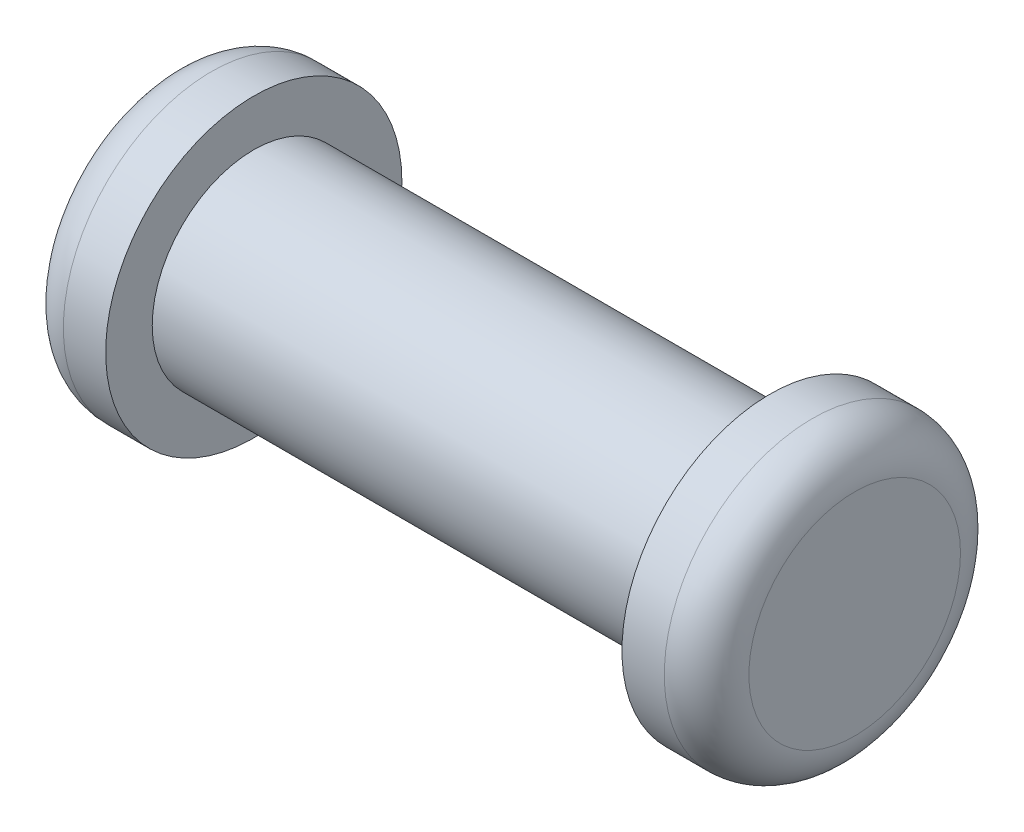
ISO-10303-21;
HEADER;
FILE_DESCRIPTION(('STEP AP214'),'2;1');
FILE_NAME('part.step','',(''),(''),'','','');
FILE_SCHEMA(('AUTOMOTIVE_DESIGN { 1 0 10303 214 1 1 1 1 }'));
ENDSEC;
DATA;
#1=APPLICATION_CONTEXT('core data for automotive mechanical design processes');
#2=APPLICATION_PROTOCOL_DEFINITION('international standard','automotive_design',2000,#1);
#3=PRODUCT_CONTEXT('',#1,'mechanical');
#4=PRODUCT('Part','Part','',(#3));
#5=PRODUCT_RELATED_PRODUCT_CATEGORY('part','',(#4));
#6=PRODUCT_DEFINITION_FORMATION('','',#4);
#7=PRODUCT_DEFINITION_CONTEXT('part definition',#1,'design');
#8=PRODUCT_DEFINITION('design','',#6,#7);
#9=PRODUCT_DEFINITION_SHAPE('','',#8);
#10=(LENGTH_UNIT() NAMED_UNIT(*) SI_UNIT(.MILLI.,.METRE.));
#11=(NAMED_UNIT(*) PLANE_ANGLE_UNIT() SI_UNIT($,.RADIAN.));
#12=(NAMED_UNIT(*) SI_UNIT($,.STERADIAN.) SOLID_ANGLE_UNIT());
#13=UNCERTAINTY_MEASURE_WITH_UNIT(LENGTH_MEASURE(1.E-05),#10,'distance_accuracy_value','');
#14=(GEOMETRIC_REPRESENTATION_CONTEXT(3) GLOBAL_UNCERTAINTY_ASSIGNED_CONTEXT((#13)) GLOBAL_UNIT_ASSIGNED_CONTEXT((#10,
#11,#12)) REPRESENTATION_CONTEXT('',''));
#15=CARTESIAN_POINT('',(0.,0.,0.));
#16=DIRECTION('',(0.,0.,1.));
#17=DIRECTION('',(1.,0.,0.));
#18=AXIS2_PLACEMENT_3D('',#15,#16,#17);
#19=CARTESIAN_POINT('',(6.1,0.,-11.));
#20=DIRECTION('',(-1.,0.,0.));
#21=DIRECTION('',(0.,0.,1.));
#22=AXIS2_PLACEMENT_3D('',#19,#20,#21);
#23=CYLINDRICAL_SURFACE('',#22,2.4);
#24=CARTESIAN_POINT('',(6.1,0.,-11.));
#25=DIRECTION('',(1.,0.,0.));
#26=DIRECTION('',(0.,0.,-1.));
#27=AXIS2_PLACEMENT_3D('',#24,#25,#26);
#28=CIRCLE('',#27,2.4);
#29=CARTESIAN_POINT('',(6.1,0.,-13.4));
#30=VERTEX_POINT('',#29);
#31=EDGE_CURVE('E56',#30,#30,#28,.T.);
#32=ORIENTED_EDGE('',*,*,#31,.F.);
#33=EDGE_LOOP('',(#32));
#34=FACE_BOUND('',#33,.T.);
#35=CARTESIAN_POINT('',(-6.1,0.,-11.));
#36=DIRECTION('',(1.,0.,0.));
#37=DIRECTION('',(0.,0.,-1.));
#38=AXIS2_PLACEMENT_3D('',#35,#36,#37);
#39=CIRCLE('',#38,2.4);
#40=CARTESIAN_POINT('',(-6.1,0.,-13.4));
#41=VERTEX_POINT('',#40);
#42=EDGE_CURVE('E71',#41,#41,#39,.T.);
#43=ORIENTED_EDGE('',*,*,#42,.T.);
#44=EDGE_LOOP('',(#43));
#45=FACE_BOUND('',#44,.T.);
#46=ADVANCED_FACE('F45',(#34,#45),#23,.T.);
#47=CARTESIAN_POINT('',(8.1,0.,-11.));
#48=DIRECTION('',(-1.,0.,0.));
#49=DIRECTION('',(0.,0.,1.));
#50=AXIS2_PLACEMENT_3D('',#47,#48,#49);
#51=CYLINDRICAL_SURFACE('',#50,3.5);
#52=CARTESIAN_POINT('',(7.1,0.,-11.));
#53=DIRECTION('',(1.,0.,0.));
#54=DIRECTION('',(0.,0.,-1.));
#55=AXIS2_PLACEMENT_3D('',#52,#53,#54);
#56=CIRCLE('',#55,3.5);
#57=CARTESIAN_POINT('',(7.1,0.,-14.5));
#58=VERTEX_POINT('',#57);
#59=EDGE_CURVE('E10',#58,#58,#56,.F.);
#60=ORIENTED_EDGE('',*,*,#59,.T.);
#61=EDGE_LOOP('',(#60));
#62=FACE_BOUND('',#61,.T.);
#63=CARTESIAN_POINT('',(6.1,0.,-11.));
#64=DIRECTION('',(1.,0.,0.));
#65=DIRECTION('',(0.,0.,-1.));
#66=AXIS2_PLACEMENT_3D('',#63,#64,#65);
#67=CIRCLE('',#66,3.5);
#68=CARTESIAN_POINT('',(6.1,0.,-14.5));
#69=VERTEX_POINT('',#68);
#70=EDGE_CURVE('E60',#69,#69,#67,.T.);
#71=ORIENTED_EDGE('',*,*,#70,.T.);
#72=EDGE_LOOP('',(#71));
#73=FACE_BOUND('',#72,.T.);
#74=ADVANCED_FACE('F96',(#62,#73),#51,.T.);
#75=CARTESIAN_POINT('',(8.1,0.,-11.));
#76=DIRECTION('',(1.,0.,0.));
#77=DIRECTION('',(0.,0.,-1.));
#78=AXIS2_PLACEMENT_3D('',#75,#76,#77);
#79=PLANE('',#78);
#80=CARTESIAN_POINT('',(8.1,0.,-11.));
#81=DIRECTION('',(1.,0.,0.));
#82=DIRECTION('',(0.,0.,-1.));
#83=AXIS2_PLACEMENT_3D('',#80,#81,#82);
#84=CIRCLE('',#83,2.5);
#85=CARTESIAN_POINT('',(8.1,0.,-13.5));
#86=VERTEX_POINT('',#85);
#87=EDGE_CURVE('E52',#86,#86,#84,.T.);
#88=ORIENTED_EDGE('',*,*,#87,.T.);
#89=EDGE_LOOP('',(#88));
#90=FACE_BOUND('',#89,.T.);
#91=ADVANCED_FACE('F101',(#90),#79,.T.);
#92=CARTESIAN_POINT('',(6.1,0.,-11.));
#93=DIRECTION('',(1.,0.,0.));
#94=DIRECTION('',(0.,0.,-1.));
#95=AXIS2_PLACEMENT_3D('',#92,#93,#94);
#96=PLANE('',#95);
#97=ORIENTED_EDGE('',*,*,#31,.T.);
#98=EDGE_LOOP('',(#97));
#99=FACE_BOUND('',#98,.T.);
#100=ORIENTED_EDGE('',*,*,#70,.F.);
#101=EDGE_LOOP('',(#100));
#102=FACE_BOUND('',#101,.T.);
#103=ADVANCED_FACE('F90',(#99,#102),#96,.F.);
#104=CARTESIAN_POINT('',(7.1,0.,-11.));
#105=DIRECTION('',(1.,0.,0.));
#106=DIRECTION('',(0.,0.,-1.));
#107=AXIS2_PLACEMENT_3D('',#104,#105,#106);
#108=TOROIDAL_SURFACE('',#107,2.5,1.);
#109=ORIENTED_EDGE('',*,*,#59,.F.);
#110=EDGE_LOOP('',(#109));
#111=FACE_BOUND('',#110,.T.);
#112=ORIENTED_EDGE('',*,*,#87,.F.);
#113=EDGE_LOOP('',(#112));
#114=FACE_BOUND('',#113,.T.);
#115=ADVANCED_FACE('F47',(#111,#114),#108,.T.);
#116=CARTESIAN_POINT('',(-8.1,0.,-11.));
#117=DIRECTION('',(1.,0.,0.));
#118=DIRECTION('',(0.,0.,1.));
#119=AXIS2_PLACEMENT_3D('',#116,#117,#118);
#120=CYLINDRICAL_SURFACE('',#119,3.5);
#121=CARTESIAN_POINT('',(-7.1,0.,-11.));
#122=DIRECTION('',(1.,0.,0.));
#123=DIRECTION('',(0.,0.,-1.));
#124=AXIS2_PLACEMENT_3D('',#121,#122,#123);
#125=CIRCLE('',#124,3.5);
#126=CARTESIAN_POINT('',(-7.1,0.,-14.5));
#127=VERTEX_POINT('',#126);
#128=EDGE_CURVE('E65',#127,#127,#125,.F.);
#129=ORIENTED_EDGE('',*,*,#128,.F.);
#130=EDGE_LOOP('',(#129));
#131=FACE_BOUND('',#130,.T.);
#132=CARTESIAN_POINT('',(-6.1,0.,-11.));
#133=DIRECTION('',(1.,0.,0.));
#134=DIRECTION('',(0.,0.,-1.));
#135=AXIS2_PLACEMENT_3D('',#132,#133,#134);
#136=CIRCLE('',#135,3.5);
#137=CARTESIAN_POINT('',(-6.1,0.,-14.5));
#138=VERTEX_POINT('',#137);
#139=EDGE_CURVE('E74',#138,#138,#136,.T.);
#140=ORIENTED_EDGE('',*,*,#139,.F.);
#141=EDGE_LOOP('',(#140));
#142=FACE_BOUND('',#141,.T.);
#143=ADVANCED_FACE('F80',(#131,#142),#120,.T.);
#144=CARTESIAN_POINT('',(-8.1,0.,-11.));
#145=DIRECTION('',(-1.,0.,0.));
#146=DIRECTION('',(0.,0.,-1.));
#147=AXIS2_PLACEMENT_3D('',#144,#145,#146);
#148=PLANE('',#147);
#149=CARTESIAN_POINT('',(-8.1,0.,-11.));
#150=DIRECTION('',(1.,0.,0.));
#151=DIRECTION('',(0.,0.,-1.));
#152=AXIS2_PLACEMENT_3D('',#149,#150,#151);
#153=CIRCLE('',#152,2.5);
#154=CARTESIAN_POINT('',(-8.1,0.,-13.5));
#155=VERTEX_POINT('',#154);
#156=EDGE_CURVE('E68',#155,#155,#153,.T.);
#157=ORIENTED_EDGE('',*,*,#156,.F.);
#158=EDGE_LOOP('',(#157));
#159=FACE_BOUND('',#158,.T.);
#160=ADVANCED_FACE('F82',(#159),#148,.T.);
#161=CARTESIAN_POINT('',(-6.1,0.,-11.));
#162=DIRECTION('',(-1.,0.,0.));
#163=DIRECTION('',(0.,0.,-1.));
#164=AXIS2_PLACEMENT_3D('',#161,#162,#163);
#165=PLANE('',#164);
#166=ORIENTED_EDGE('',*,*,#42,.F.);
#167=EDGE_LOOP('',(#166));
#168=FACE_BOUND('',#167,.T.);
#169=ORIENTED_EDGE('',*,*,#139,.T.);
#170=EDGE_LOOP('',(#169));
#171=FACE_BOUND('',#170,.T.);
#172=ADVANCED_FACE('F78',(#168,#171),#165,.F.);
#173=CARTESIAN_POINT('',(-7.1,0.,-11.));
#174=DIRECTION('',(-1.,0.,0.));
#175=DIRECTION('',(0.,0.,-1.));
#176=AXIS2_PLACEMENT_3D('',#173,#174,#175);
#177=TOROIDAL_SURFACE('',#176,2.5,1.);
#178=ORIENTED_EDGE('',*,*,#128,.T.);
#179=EDGE_LOOP('',(#178));
#180=FACE_BOUND('',#179,.T.);
#181=ORIENTED_EDGE('',*,*,#156,.T.);
#182=EDGE_LOOP('',(#181));
#183=FACE_BOUND('',#182,.T.);
#184=ADVANCED_FACE('F110',(#180,#183),#177,.T.);
#185=CLOSED_SHELL('',(#46,#74,#91,#103,#115,#143,#160,#172,#184));
#186=MANIFOLD_SOLID_BREP('B2',#185);
#187=ADVANCED_BREP_SHAPE_REPRESENTATION('',(#18,#186),#14);
#188=SHAPE_DEFINITION_REPRESENTATION(#9,#187);
ENDSEC;
END-ISO-10303-21;
